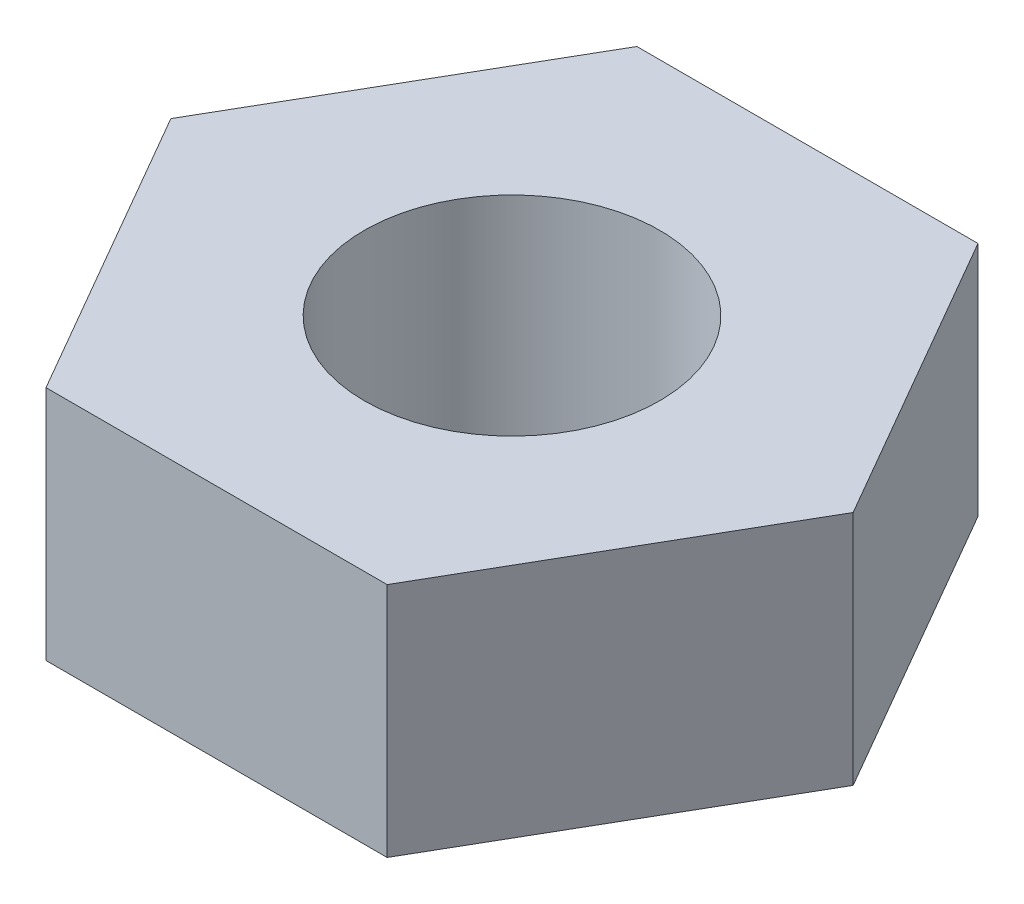
ISO-10303-21;
HEADER;
FILE_DESCRIPTION(('STEP AP214'),'2;1');
FILE_NAME('part.step','',(''),(''),'','','');
FILE_SCHEMA(('AUTOMOTIVE_DESIGN { 1 0 10303 214 1 1 1 1 }'));
ENDSEC;
DATA;
#1=APPLICATION_CONTEXT('core data for automotive mechanical design processes');
#2=APPLICATION_PROTOCOL_DEFINITION('international standard','automotive_design',2000,#1);
#3=PRODUCT_CONTEXT('',#1,'mechanical');
#4=PRODUCT('Part','Part','',(#3));
#5=PRODUCT_RELATED_PRODUCT_CATEGORY('part','',(#4));
#6=PRODUCT_DEFINITION_FORMATION('','',#4);
#7=PRODUCT_DEFINITION_CONTEXT('part definition',#1,'design');
#8=PRODUCT_DEFINITION('design','',#6,#7);
#9=PRODUCT_DEFINITION_SHAPE('','',#8);
#10=(LENGTH_UNIT() NAMED_UNIT(*) SI_UNIT(.MILLI.,.METRE.));
#11=(NAMED_UNIT(*) PLANE_ANGLE_UNIT() SI_UNIT($,.RADIAN.));
#12=(NAMED_UNIT(*) SI_UNIT($,.STERADIAN.) SOLID_ANGLE_UNIT());
#13=UNCERTAINTY_MEASURE_WITH_UNIT(LENGTH_MEASURE(1.E-05),#10,'distance_accuracy_value','');
#14=(GEOMETRIC_REPRESENTATION_CONTEXT(3) GLOBAL_UNCERTAINTY_ASSIGNED_CONTEXT((#13)) GLOBAL_UNIT_ASSIGNED_CONTEXT((#10,
#11,#12)) REPRESENTATION_CONTEXT('',''));
#15=CARTESIAN_POINT('',(0.,0.,0.));
#16=DIRECTION('',(0.,0.,1.));
#17=DIRECTION('',(1.,0.,0.));
#18=AXIS2_PLACEMENT_3D('',#15,#16,#17);
#19=CARTESIAN_POINT('',(0.,1.6,0.));
#20=DIRECTION('',(0.,1.,0.));
#21=DIRECTION('',(0.,0.,1.));
#22=AXIS2_PLACEMENT_3D('',#19,#20,#21);
#23=PLANE('',#22);
#24=DIRECTION('',(1.,0.,0.));
#25=VECTOR('',#24,1.);
#26=CARTESIAN_POINT('',(-1.15470053837925,1.6,2.));
#27=LINE('',#26,#25);
#28=CARTESIAN_POINT('',(-1.15470053837925,1.6,2.));
#29=VERTEX_POINT('',#28);
#30=CARTESIAN_POINT('',(1.15470053837925,1.6,2.));
#31=VERTEX_POINT('',#30);
#32=EDGE_CURVE('E137',#29,#31,#27,.T.);
#33=ORIENTED_EDGE('',*,*,#32,.T.);
#34=DIRECTION('',(0.5,0.,-0.866025403784439));
#35=VECTOR('',#34,1.);
#36=CARTESIAN_POINT('',(1.15470053837925,1.6,2.));
#37=LINE('',#36,#35);
#38=CARTESIAN_POINT('',(2.3094010767585,1.6,0.));
#39=VERTEX_POINT('',#38);
#40=EDGE_CURVE('E95',#31,#39,#37,.T.);
#41=ORIENTED_EDGE('',*,*,#40,.T.);
#42=DIRECTION('',(-0.5,0.,-0.866025403784438));
#43=VECTOR('',#42,1.);
#44=CARTESIAN_POINT('',(2.3094010767585,1.6,0.));
#45=LINE('',#44,#43);
#46=CARTESIAN_POINT('',(1.15470053837925,1.6,-2.));
#47=VERTEX_POINT('',#46);
#48=EDGE_CURVE('E108',#39,#47,#45,.T.);
#49=ORIENTED_EDGE('',*,*,#48,.T.);
#50=DIRECTION('',(-1.,0.,0.));
#51=VECTOR('',#50,1.);
#52=CARTESIAN_POINT('',(1.15470053837925,1.6,-2.));
#53=LINE('',#52,#51);
#54=CARTESIAN_POINT('',(-1.15470053837925,1.6,-2.));
#55=VERTEX_POINT('',#54);
#56=EDGE_CURVE('E102',#47,#55,#53,.T.);
#57=ORIENTED_EDGE('',*,*,#56,.T.);
#58=DIRECTION('',(-0.5,0.,0.866025403784438));
#59=VECTOR('',#58,1.);
#60=CARTESIAN_POINT('',(-1.15470053837925,1.6,-2.));
#61=LINE('',#60,#59);
#62=CARTESIAN_POINT('',(-2.3094010767585,1.6,0.));
#63=VERTEX_POINT('',#62);
#64=EDGE_CURVE('E106',#55,#63,#61,.T.);
#65=ORIENTED_EDGE('',*,*,#64,.T.);
#66=DIRECTION('',(0.5,0.,0.866025403784439));
#67=VECTOR('',#66,1.);
#68=CARTESIAN_POINT('',(-2.3094010767585,1.6,0.));
#69=LINE('',#68,#67);
#70=EDGE_CURVE('E58',#63,#29,#69,.T.);
#71=ORIENTED_EDGE('',*,*,#70,.T.);
#72=EDGE_LOOP('',(#33,#41,#49,#57,#65,#71));
#73=FACE_BOUND('',#72,.T.);
#74=CARTESIAN_POINT('',(0.,1.6,0.));
#75=DIRECTION('',(0.,1.,0.));
#76=DIRECTION('',(0.,0.,1.));
#77=AXIS2_PLACEMENT_3D('',#74,#75,#76);
#78=CIRCLE('',#77,1.);
#79=CARTESIAN_POINT('',(0.,1.6,1.));
#80=VERTEX_POINT('',#79);
#81=EDGE_CURVE('E130',#80,#80,#78,.T.);
#82=ORIENTED_EDGE('',*,*,#81,.F.);
#83=EDGE_LOOP('',(#82));
#84=FACE_BOUND('',#83,.T.);
#85=ADVANCED_FACE('F41',(#73,#84),#23,.T.);
#86=CARTESIAN_POINT('',(0.,0.,0.));
#87=DIRECTION('',(0.,1.,0.));
#88=DIRECTION('',(0.,0.,1.));
#89=AXIS2_PLACEMENT_3D('',#86,#87,#88);
#90=PLANE('',#89);
#91=DIRECTION('',(1.,0.,0.));
#92=VECTOR('',#91,1.);
#93=CARTESIAN_POINT('',(-1.15470053837925,0.,2.));
#94=LINE('',#93,#92);
#95=CARTESIAN_POINT('',(-1.15470053837925,0.,2.));
#96=VERTEX_POINT('',#95);
#97=CARTESIAN_POINT('',(1.15470053837925,0.,2.));
#98=VERTEX_POINT('',#97);
#99=EDGE_CURVE('E126',#96,#98,#94,.T.);
#100=ORIENTED_EDGE('',*,*,#99,.F.);
#101=DIRECTION('',(0.5,0.,0.866025403784439));
#102=VECTOR('',#101,1.);
#103=CARTESIAN_POINT('',(-2.3094010767585,0.,0.));
#104=LINE('',#103,#102);
#105=CARTESIAN_POINT('',(-2.3094010767585,0.,0.));
#106=VERTEX_POINT('',#105);
#107=EDGE_CURVE('E87',#106,#96,#104,.T.);
#108=ORIENTED_EDGE('',*,*,#107,.F.);
#109=DIRECTION('',(-0.5,0.,0.866025403784438));
#110=VECTOR('',#109,1.);
#111=CARTESIAN_POINT('',(-1.15470053837925,0.,-2.));
#112=LINE('',#111,#110);
#113=CARTESIAN_POINT('',(-1.15470053837925,0.,-2.));
#114=VERTEX_POINT('',#113);
#115=EDGE_CURVE('E81',#114,#106,#112,.T.);
#116=ORIENTED_EDGE('',*,*,#115,.F.);
#117=DIRECTION('',(-1.,0.,0.));
#118=VECTOR('',#117,1.);
#119=CARTESIAN_POINT('',(1.15470053837925,0.,-2.));
#120=LINE('',#119,#118);
#121=CARTESIAN_POINT('',(1.15470053837925,0.,-2.));
#122=VERTEX_POINT('',#121);
#123=EDGE_CURVE('E116',#122,#114,#120,.T.);
#124=ORIENTED_EDGE('',*,*,#123,.F.);
#125=DIRECTION('',(-0.5,0.,-0.866025403784438));
#126=VECTOR('',#125,1.);
#127=CARTESIAN_POINT('',(2.3094010767585,0.,0.));
#128=LINE('',#127,#126);
#129=CARTESIAN_POINT('',(2.3094010767585,0.,0.));
#130=VERTEX_POINT('',#129);
#131=EDGE_CURVE('E132',#130,#122,#128,.T.);
#132=ORIENTED_EDGE('',*,*,#131,.F.);
#133=DIRECTION('',(0.5,0.,-0.866025403784439));
#134=VECTOR('',#133,1.);
#135=CARTESIAN_POINT('',(1.15470053837925,0.,2.));
#136=LINE('',#135,#134);
#137=EDGE_CURVE('E129',#98,#130,#136,.T.);
#138=ORIENTED_EDGE('',*,*,#137,.F.);
#139=EDGE_LOOP('',(#100,#108,#116,#124,#132,#138));
#140=FACE_BOUND('',#139,.T.);
#141=CARTESIAN_POINT('',(0.,0.,0.));
#142=DIRECTION('',(0.,1.,0.));
#143=DIRECTION('',(0.,0.,1.));
#144=AXIS2_PLACEMENT_3D('',#141,#142,#143);
#145=CIRCLE('',#144,1.);
#146=CARTESIAN_POINT('',(0.,0.,1.));
#147=VERTEX_POINT('',#146);
#148=EDGE_CURVE('E230',#147,#147,#145,.T.);
#149=ORIENTED_EDGE('',*,*,#148,.T.);
#150=EDGE_LOOP('',(#149));
#151=FACE_BOUND('',#150,.T.);
#152=ADVANCED_FACE('F146',(#140,#151),#90,.F.);
#153=CARTESIAN_POINT('',(-1.15470053837925,1.6,2.));
#154=DIRECTION('',(0.,0.,-1.));
#155=DIRECTION('',(-1.,0.,0.));
#156=AXIS2_PLACEMENT_3D('',#153,#154,#155);
#157=PLANE('',#156);
#158=ORIENTED_EDGE('',*,*,#99,.T.);
#159=DIRECTION('',(0.,-1.,0.));
#160=VECTOR('',#159,1.);
#161=CARTESIAN_POINT('',(1.15470053837925,1.6,2.));
#162=LINE('',#161,#160);
#163=EDGE_CURVE('E11',#31,#98,#162,.T.);
#164=ORIENTED_EDGE('',*,*,#163,.F.);
#165=ORIENTED_EDGE('',*,*,#32,.F.);
#166=DIRECTION('',(0.,-1.,0.));
#167=VECTOR('',#166,1.);
#168=CARTESIAN_POINT('',(-1.15470053837925,1.6,2.));
#169=LINE('',#168,#167);
#170=EDGE_CURVE('E122',#29,#96,#169,.T.);
#171=ORIENTED_EDGE('',*,*,#170,.T.);
#172=EDGE_LOOP('',(#158,#164,#165,#171));
#173=FACE_BOUND('',#172,.T.);
#174=ADVANCED_FACE('F43',(#173),#157,.F.);
#175=CARTESIAN_POINT('',(1.15470053837925,1.6,2.));
#176=DIRECTION('',(-0.866025403784439,0.,-0.5));
#177=DIRECTION('',(-0.5,0.,0.866025403784439));
#178=AXIS2_PLACEMENT_3D('',#175,#176,#177);
#179=PLANE('',#178);
#180=ORIENTED_EDGE('',*,*,#137,.T.);
#181=DIRECTION('',(0.,-1.,0.));
#182=VECTOR('',#181,1.);
#183=CARTESIAN_POINT('',(2.3094010767585,1.6,0.));
#184=LINE('',#183,#182);
#185=EDGE_CURVE('E50',#39,#130,#184,.T.);
#186=ORIENTED_EDGE('',*,*,#185,.F.);
#187=ORIENTED_EDGE('',*,*,#40,.F.);
#188=ORIENTED_EDGE('',*,*,#163,.T.);
#189=EDGE_LOOP('',(#180,#186,#187,#188));
#190=FACE_BOUND('',#189,.T.);
#191=ADVANCED_FACE('F171',(#190),#179,.F.);
#192=CARTESIAN_POINT('',(2.3094010767585,1.6,0.));
#193=DIRECTION('',(-0.866025403784438,0.,0.5));
#194=DIRECTION('',(0.5,0.,0.866025403784439));
#195=AXIS2_PLACEMENT_3D('',#192,#193,#194);
#196=PLANE('',#195);
#197=ORIENTED_EDGE('',*,*,#131,.T.);
#198=DIRECTION('',(0.,-1.,0.));
#199=VECTOR('',#198,1.);
#200=CARTESIAN_POINT('',(1.15470053837925,1.6,-2.));
#201=LINE('',#200,#199);
#202=EDGE_CURVE('E117',#47,#122,#201,.T.);
#203=ORIENTED_EDGE('',*,*,#202,.F.);
#204=ORIENTED_EDGE('',*,*,#48,.F.);
#205=ORIENTED_EDGE('',*,*,#185,.T.);
#206=EDGE_LOOP('',(#197,#203,#204,#205));
#207=FACE_BOUND('',#206,.T.);
#208=ADVANCED_FACE('F143',(#207),#196,.F.);
#209=CARTESIAN_POINT('',(1.15470053837925,1.6,-2.));
#210=DIRECTION('',(0.,0.,1.));
#211=DIRECTION('',(1.,0.,0.));
#212=AXIS2_PLACEMENT_3D('',#209,#210,#211);
#213=PLANE('',#212);
#214=ORIENTED_EDGE('',*,*,#123,.T.);
#215=DIRECTION('',(0.,-1.,0.));
#216=VECTOR('',#215,1.);
#217=CARTESIAN_POINT('',(-1.15470053837925,1.6,-2.));
#218=LINE('',#217,#216);
#219=EDGE_CURVE('E113',#55,#114,#218,.T.);
#220=ORIENTED_EDGE('',*,*,#219,.F.);
#221=ORIENTED_EDGE('',*,*,#56,.F.);
#222=ORIENTED_EDGE('',*,*,#202,.T.);
#223=EDGE_LOOP('',(#214,#220,#221,#222));
#224=FACE_BOUND('',#223,.T.);
#225=ADVANCED_FACE('F114',(#224),#213,.F.);
#226=CARTESIAN_POINT('',(-1.15470053837925,1.6,-2.));
#227=DIRECTION('',(0.866025403784438,0.,0.5));
#228=DIRECTION('',(0.5,0.,-0.866025403784439));
#229=AXIS2_PLACEMENT_3D('',#226,#227,#228);
#230=PLANE('',#229);
#231=ORIENTED_EDGE('',*,*,#115,.T.);
#232=DIRECTION('',(0.,-1.,0.));
#233=VECTOR('',#232,1.);
#234=CARTESIAN_POINT('',(-2.3094010767585,1.6,0.));
#235=LINE('',#234,#233);
#236=EDGE_CURVE('E118',#63,#106,#235,.T.);
#237=ORIENTED_EDGE('',*,*,#236,.F.);
#238=ORIENTED_EDGE('',*,*,#64,.F.);
#239=ORIENTED_EDGE('',*,*,#219,.T.);
#240=EDGE_LOOP('',(#231,#237,#238,#239));
#241=FACE_BOUND('',#240,.T.);
#242=ADVANCED_FACE('F120',(#241),#230,.F.);
#243=CARTESIAN_POINT('',(-2.3094010767585,1.6,0.));
#244=DIRECTION('',(0.866025403784439,0.,-0.5));
#245=DIRECTION('',(-0.5,0.,-0.866025403784439));
#246=AXIS2_PLACEMENT_3D('',#243,#244,#245);
#247=PLANE('',#246);
#248=ORIENTED_EDGE('',*,*,#107,.T.);
#249=ORIENTED_EDGE('',*,*,#170,.F.);
#250=ORIENTED_EDGE('',*,*,#70,.F.);
#251=ORIENTED_EDGE('',*,*,#236,.T.);
#252=EDGE_LOOP('',(#248,#249,#250,#251));
#253=FACE_BOUND('',#252,.T.);
#254=ADVANCED_FACE('F151',(#253),#247,.F.);
#255=CARTESIAN_POINT('',(0.,1.6,0.));
#256=DIRECTION('',(0.,-1.,0.));
#257=DIRECTION('',(0.,0.,-1.));
#258=AXIS2_PLACEMENT_3D('',#255,#256,#257);
#259=CYLINDRICAL_SURFACE('',#258,1.);
#260=ORIENTED_EDGE('',*,*,#81,.T.);
#261=EDGE_LOOP('',(#260));
#262=FACE_BOUND('',#261,.T.);
#263=ORIENTED_EDGE('',*,*,#148,.F.);
#264=EDGE_LOOP('',(#263));
#265=FACE_BOUND('',#264,.T.);
#266=ADVANCED_FACE('F153',(#262,#265),#259,.F.);
#267=CLOSED_SHELL('',(#85,#152,#174,#191,#208,#225,#242,#254,#266));
#268=MANIFOLD_SOLID_BREP('B2',#267);
#269=ADVANCED_BREP_SHAPE_REPRESENTATION('',(#18,#268),#14);
#270=SHAPE_DEFINITION_REPRESENTATION(#9,#269);
ENDSEC;
END-ISO-10303-21;
